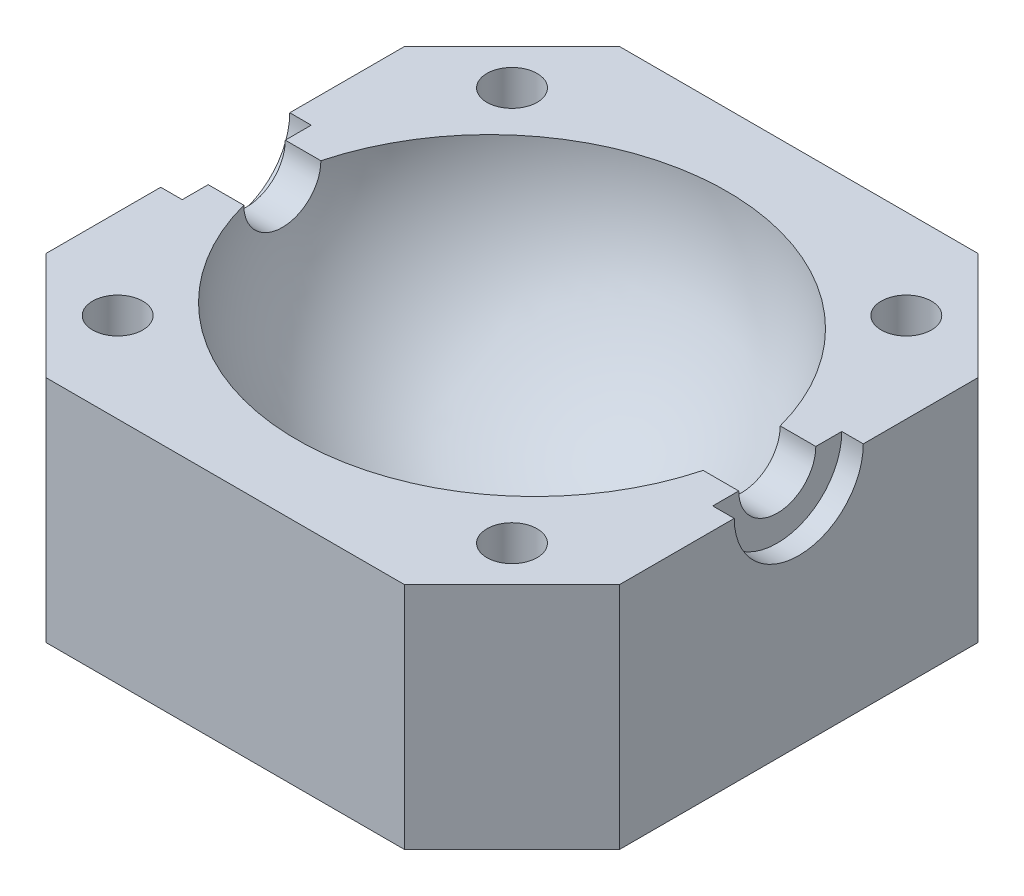
ISO-10303-21;
HEADER;
FILE_DESCRIPTION(('STEP AP214'),'2;1');
FILE_NAME('part.step','',(''),(''),'','','');
FILE_SCHEMA(('AUTOMOTIVE_DESIGN { 1 0 10303 214 1 1 1 1 }'));
ENDSEC;
DATA;
#1=APPLICATION_CONTEXT('core data for automotive mechanical design processes');
#2=APPLICATION_PROTOCOL_DEFINITION('international standard','automotive_design',2000,#1);
#3=PRODUCT_CONTEXT('',#1,'mechanical');
#4=PRODUCT('Part','Part','',(#3));
#5=PRODUCT_RELATED_PRODUCT_CATEGORY('part','',(#4));
#6=PRODUCT_DEFINITION_FORMATION('','',#4);
#7=PRODUCT_DEFINITION_CONTEXT('part definition',#1,'design');
#8=PRODUCT_DEFINITION('design','',#6,#7);
#9=PRODUCT_DEFINITION_SHAPE('','',#8);
#10=(LENGTH_UNIT() NAMED_UNIT(*) SI_UNIT(.MILLI.,.METRE.));
#11=(NAMED_UNIT(*) PLANE_ANGLE_UNIT() SI_UNIT($,.RADIAN.));
#12=(NAMED_UNIT(*) SI_UNIT($,.STERADIAN.) SOLID_ANGLE_UNIT());
#13=UNCERTAINTY_MEASURE_WITH_UNIT(LENGTH_MEASURE(1.E-05),#10,'distance_accuracy_value','');
#14=(GEOMETRIC_REPRESENTATION_CONTEXT(3) GLOBAL_UNCERTAINTY_ASSIGNED_CONTEXT((#13)) GLOBAL_UNIT_ASSIGNED_CONTEXT((#10,
#11,#12)) REPRESENTATION_CONTEXT('',''));
#15=CARTESIAN_POINT('',(0.,0.,0.));
#16=DIRECTION('',(0.,0.,1.));
#17=DIRECTION('',(1.,0.,0.));
#18=AXIS2_PLACEMENT_3D('',#15,#16,#17);
#19=CARTESIAN_POINT('',(40.,32.,0.));
#20=DIRECTION('',(-1.,0.,0.));
#21=DIRECTION('',(0.,0.,1.));
#22=AXIS2_PLACEMENT_3D('',#19,#20,#21);
#23=CYLINDRICAL_SURFACE('',#22,5.375);
#24=CARTESIAN_POINT('',(37.,32.,0.));
#25=DIRECTION('',(1.,0.,0.));
#26=DIRECTION('',(0.,0.,-1.));
#27=AXIS2_PLACEMENT_3D('',#24,#25,#26);
#28=CIRCLE('',#27,5.375);
#29=CARTESIAN_POINT('',(37.,32.,-5.37500000000001));
#30=VERTEX_POINT('',#29);
#31=CARTESIAN_POINT('',(37.,32.,5.37499999999999));
#32=VERTEX_POINT('',#31);
#33=EDGE_CURVE('E11',#30,#32,#28,.F.);
#34=ORIENTED_EDGE('',*,*,#33,.F.);
#35=DIRECTION('',(-1.,0.,0.));
#36=VECTOR('',#35,1.);
#37=CARTESIAN_POINT('',(40.,32.,-5.37500000000001));
#38=LINE('',#37,#36);
#39=CARTESIAN_POINT('',(32.0350881846765,32.,-5.375));
#40=VERTEX_POINT('',#39);
#41=EDGE_CURVE('E211',#30,#40,#38,.T.);
#42=ORIENTED_EDGE('',*,*,#41,.T.);
#43=CARTESIAN_POINT('',(32.0350881846765,32.,0.));
#44=DIRECTION('',(-1.,0.,0.));
#45=DIRECTION('',(0.,0.,1.));
#46=AXIS2_PLACEMENT_3D('',#43,#44,#45);
#47=CIRCLE('',#46,5.375);
#48=CARTESIAN_POINT('',(32.0350881846765,32.,5.375));
#49=VERTEX_POINT('',#48);
#50=EDGE_CURVE('E245',#49,#40,#47,.F.);
#51=ORIENTED_EDGE('',*,*,#50,.F.);
#52=DIRECTION('',(-1.,0.,0.));
#53=VECTOR('',#52,1.);
#54=CARTESIAN_POINT('',(40.,32.,5.37499999999999));
#55=LINE('',#54,#53);
#56=EDGE_CURVE('E207',#49,#32,#55,.F.);
#57=ORIENTED_EDGE('',*,*,#56,.T.);
#58=EDGE_LOOP('',(#34,#42,#51,#57));
#59=FACE_BOUND('',#58,.T.);
#60=ADVANCED_FACE('F35',(#59),#23,.F.);
#61=CARTESIAN_POINT('',(0.,32.,0.));
#62=DIRECTION('',(0.,1.,0.));
#63=DIRECTION('',(0.,0.,1.));
#64=AXIS2_PLACEMENT_3D('',#61,#62,#63);
#65=PLANE('',#64);
#66=DIRECTION('',(-1.,0.,0.));
#67=VECTOR('',#66,1.);
#68=CARTESIAN_POINT('',(40.,32.,-9.));
#69=LINE('',#68,#67);
#70=CARTESIAN_POINT('',(40.,32.,-9.));
#71=VERTEX_POINT('',#70);
#72=CARTESIAN_POINT('',(37.,32.,-9.));
#73=VERTEX_POINT('',#72);
#74=EDGE_CURVE('E163',#71,#73,#69,.T.);
#75=ORIENTED_EDGE('',*,*,#74,.F.);
#76=DIRECTION('',(0.,0.,-1.));
#77=VECTOR('',#76,1.);
#78=CARTESIAN_POINT('',(40.,32.,-40.));
#79=LINE('',#78,#77);
#80=CARTESIAN_POINT('',(40.,32.,-24.9999999999999));
#81=VERTEX_POINT('',#80);
#82=EDGE_CURVE('E217',#71,#81,#79,.T.);
#83=ORIENTED_EDGE('',*,*,#82,.T.);
#84=DIRECTION('',(0.707106781186546,0.,0.707106781186549));
#85=VECTOR('',#84,1.);
#86=CARTESIAN_POINT('',(32.5,32.,-32.4999999999999));
#87=LINE('',#86,#85);
#88=CARTESIAN_POINT('',(25.,32.,-40.));
#89=VERTEX_POINT('',#88);
#90=EDGE_CURVE('E272',#81,#89,#87,.F.);
#91=ORIENTED_EDGE('',*,*,#90,.T.);
#92=DIRECTION('',(-1.,0.,0.));
#93=VECTOR('',#92,1.);
#94=CARTESIAN_POINT('',(-40.,32.,-40.));
#95=LINE('',#94,#93);
#96=CARTESIAN_POINT('',(-24.9999999999999,32.,-40.));
#97=VERTEX_POINT('',#96);
#98=EDGE_CURVE('E216',#89,#97,#95,.T.);
#99=ORIENTED_EDGE('',*,*,#98,.T.);
#100=DIRECTION('',(0.707106781186549,0.,-0.707106781186546));
#101=VECTOR('',#100,1.);
#102=CARTESIAN_POINT('',(-32.4999999999999,32.,-32.5000000000001));
#103=LINE('',#102,#101);
#104=CARTESIAN_POINT('',(-40.,32.,-25.));
#105=VERTEX_POINT('',#104);
#106=EDGE_CURVE('E270',#97,#105,#103,.F.);
#107=ORIENTED_EDGE('',*,*,#106,.T.);
#108=DIRECTION('',(0.,0.,1.));
#109=VECTOR('',#108,1.);
#110=CARTESIAN_POINT('',(-40.,32.,-40.));
#111=LINE('',#110,#109);
#112=CARTESIAN_POINT('',(-40.,32.,-9.));
#113=VERTEX_POINT('',#112);
#114=EDGE_CURVE('E221',#105,#113,#111,.T.);
#115=ORIENTED_EDGE('',*,*,#114,.T.);
#116=DIRECTION('',(1.,0.,0.));
#117=VECTOR('',#116,1.);
#118=CARTESIAN_POINT('',(-40.,32.,-9.));
#119=LINE('',#118,#117);
#120=CARTESIAN_POINT('',(-37.,32.,-9.));
#121=VERTEX_POINT('',#120);
#122=EDGE_CURVE('E182',#113,#121,#119,.T.);
#123=ORIENTED_EDGE('',*,*,#122,.T.);
#124=DIRECTION('',(0.,0.,1.));
#125=VECTOR('',#124,1.);
#126=CARTESIAN_POINT('',(-37.,32.,0.));
#127=LINE('',#126,#125);
#128=CARTESIAN_POINT('',(-37.,32.,-5.37499999999999));
#129=VERTEX_POINT('',#128);
#130=EDGE_CURVE('E179',#121,#129,#127,.T.);
#131=ORIENTED_EDGE('',*,*,#130,.T.);
#132=CARTESIAN_POINT('',(-32.0350881846765,32.,-5.37499999999999));
#133=VERTEX_POINT('',#132);
#134=EDGE_CURVE('E214',#133,#129,#38,.T.);
#135=ORIENTED_EDGE('',*,*,#134,.F.);
#136=CARTESIAN_POINT('',(0.,32.,3.15000000000001));
#137=DIRECTION('',(0.,1.,0.));
#138=DIRECTION('',(0.,0.,1.));
#139=AXIS2_PLACEMENT_3D('',#136,#137,#138);
#140=CIRCLE('',#139,33.15);
#141=EDGE_CURVE('E242',#40,#133,#140,.T.);
#142=ORIENTED_EDGE('',*,*,#141,.F.);
#143=ORIENTED_EDGE('',*,*,#41,.F.);
#144=DIRECTION('',(0.,0.,-1.));
#145=VECTOR('',#144,1.);
#146=CARTESIAN_POINT('',(37.,32.,0.));
#147=LINE('',#146,#145);
#148=EDGE_CURVE('E50',#30,#73,#147,.T.);
#149=ORIENTED_EDGE('',*,*,#148,.T.);
#150=EDGE_LOOP('',(#75,#83,#91,#99,#107,#115,#123,#131,#135,#142,#143,#149));
#151=FACE_BOUND('',#150,.T.);
#152=CARTESIAN_POINT('',(27.5,32.,-27.5));
#153=DIRECTION('',(0.,1.,0.));
#154=DIRECTION('',(0.,0.,1.));
#155=AXIS2_PLACEMENT_3D('',#152,#153,#154);
#156=CIRCLE('',#155,3.5);
#157=CARTESIAN_POINT('',(27.5,32.,-24.));
#158=VERTEX_POINT('',#157);
#159=EDGE_CURVE('E190',#158,#158,#156,.T.);
#160=ORIENTED_EDGE('',*,*,#159,.F.);
#161=EDGE_LOOP('',(#160));
#162=FACE_BOUND('',#161,.T.);
#163=CARTESIAN_POINT('',(-27.5,32.,-27.5));
#164=DIRECTION('',(0.,1.,0.));
#165=DIRECTION('',(0.,0.,1.));
#166=AXIS2_PLACEMENT_3D('',#163,#164,#165);
#167=CIRCLE('',#166,3.5);
#168=CARTESIAN_POINT('',(-27.5,32.,-24.));
#169=VERTEX_POINT('',#168);
#170=EDGE_CURVE('E189',#169,#169,#167,.T.);
#171=ORIENTED_EDGE('',*,*,#170,.F.);
#172=EDGE_LOOP('',(#171));
#173=FACE_BOUND('',#172,.T.);
#174=ADVANCED_FACE('F319',(#151,#162,#173),#65,.T.);
#175=DIRECTION('',(-1.,0.,0.));
#176=VECTOR('',#175,1.);
#177=CARTESIAN_POINT('',(40.,32.,9.));
#178=LINE('',#177,#176);
#179=CARTESIAN_POINT('',(37.,32.,9.));
#180=VERTEX_POINT('',#179);
#181=CARTESIAN_POINT('',(40.,32.,9.));
#182=VERTEX_POINT('',#181);
#183=EDGE_CURVE('E160',#180,#182,#178,.F.);
#184=ORIENTED_EDGE('',*,*,#183,.F.);
#185=DIRECTION('',(0.,0.,-1.));
#186=VECTOR('',#185,1.);
#187=CARTESIAN_POINT('',(37.,32.,0.));
#188=LINE('',#187,#186);
#189=EDGE_CURVE('E148',#180,#32,#188,.T.);
#190=ORIENTED_EDGE('',*,*,#189,.T.);
#191=ORIENTED_EDGE('',*,*,#56,.F.);
#192=CARTESIAN_POINT('',(0.,32.,-3.15));
#193=DIRECTION('',(0.,1.,0.));
#194=DIRECTION('',(0.,0.,1.));
#195=AXIS2_PLACEMENT_3D('',#192,#193,#194);
#196=CIRCLE('',#195,33.15);
#197=CARTESIAN_POINT('',(-32.0350881846765,32.,5.37500000000001));
#198=VERTEX_POINT('',#197);
#199=EDGE_CURVE('E227',#198,#49,#196,.T.);
#200=ORIENTED_EDGE('',*,*,#199,.F.);
#201=CARTESIAN_POINT('',(-37.,32.,5.375));
#202=VERTEX_POINT('',#201);
#203=EDGE_CURVE('E212',#202,#198,#55,.F.);
#204=ORIENTED_EDGE('',*,*,#203,.F.);
#205=DIRECTION('',(0.,0.,1.));
#206=VECTOR('',#205,1.);
#207=CARTESIAN_POINT('',(-37.,32.,0.));
#208=LINE('',#207,#206);
#209=CARTESIAN_POINT('',(-37.,32.,9.));
#210=VERTEX_POINT('',#209);
#211=EDGE_CURVE('E58',#202,#210,#208,.T.);
#212=ORIENTED_EDGE('',*,*,#211,.T.);
#213=DIRECTION('',(1.,0.,0.));
#214=VECTOR('',#213,1.);
#215=CARTESIAN_POINT('',(-40.,32.,9.));
#216=LINE('',#215,#214);
#217=CARTESIAN_POINT('',(-40.,32.,9.));
#218=VERTEX_POINT('',#217);
#219=EDGE_CURVE('E44',#210,#218,#216,.F.);
#220=ORIENTED_EDGE('',*,*,#219,.T.);
#221=CARTESIAN_POINT('',(-40.,32.,24.9999999999999));
#222=VERTEX_POINT('',#221);
#223=EDGE_CURVE('E220',#218,#222,#111,.T.);
#224=ORIENTED_EDGE('',*,*,#223,.T.);
#225=DIRECTION('',(-0.707106781186546,0.,-0.707106781186549));
#226=VECTOR('',#225,1.);
#227=CARTESIAN_POINT('',(-32.5,32.,32.4999999999999));
#228=LINE('',#227,#226);
#229=CARTESIAN_POINT('',(-25.,32.,40.));
#230=VERTEX_POINT('',#229);
#231=EDGE_CURVE('E285',#222,#230,#228,.F.);
#232=ORIENTED_EDGE('',*,*,#231,.T.);
#233=DIRECTION('',(1.,0.,0.));
#234=VECTOR('',#233,1.);
#235=CARTESIAN_POINT('',(-40.,32.,40.));
#236=LINE('',#235,#234);
#237=CARTESIAN_POINT('',(24.9999999999999,32.,40.));
#238=VERTEX_POINT('',#237);
#239=EDGE_CURVE('E224',#230,#238,#236,.T.);
#240=ORIENTED_EDGE('',*,*,#239,.T.);
#241=DIRECTION('',(-0.70710678118655,0.,0.707106781186546));
#242=VECTOR('',#241,1.);
#243=CARTESIAN_POINT('',(32.4999999999999,32.,32.5000000000001));
#244=LINE('',#243,#242);
#245=CARTESIAN_POINT('',(40.,32.,25.));
#246=VERTEX_POINT('',#245);
#247=EDGE_CURVE('E287',#238,#246,#244,.F.);
#248=ORIENTED_EDGE('',*,*,#247,.T.);
#249=EDGE_CURVE('E169',#246,#182,#79,.T.);
#250=ORIENTED_EDGE('',*,*,#249,.T.);
#251=EDGE_LOOP('',(#184,#190,#191,#200,#204,#212,#220,#224,#232,#240,#248,#250));
#252=FACE_BOUND('',#251,.T.);
#253=CARTESIAN_POINT('',(-27.5,32.,27.5));
#254=DIRECTION('',(0.,1.,0.));
#255=DIRECTION('',(0.,0.,1.));
#256=AXIS2_PLACEMENT_3D('',#253,#254,#255);
#257=CIRCLE('',#256,3.5);
#258=CARTESIAN_POINT('',(-27.5,32.,31.));
#259=VERTEX_POINT('',#258);
#260=EDGE_CURVE('E185',#259,#259,#257,.T.);
#261=ORIENTED_EDGE('',*,*,#260,.F.);
#262=EDGE_LOOP('',(#261));
#263=FACE_BOUND('',#262,.T.);
#264=CARTESIAN_POINT('',(27.5,32.,27.5));
#265=DIRECTION('',(0.,1.,0.));
#266=DIRECTION('',(0.,0.,1.));
#267=AXIS2_PLACEMENT_3D('',#264,#265,#266);
#268=CIRCLE('',#267,3.5);
#269=CARTESIAN_POINT('',(27.5,32.,31.));
#270=VERTEX_POINT('',#269);
#271=EDGE_CURVE('E196',#270,#270,#268,.T.);
#272=ORIENTED_EDGE('',*,*,#271,.F.);
#273=EDGE_LOOP('',(#272));
#274=FACE_BOUND('',#273,.T.);
#275=ADVANCED_FACE('F166',(#252,#263,#274),#65,.T.);
#276=CARTESIAN_POINT('',(-37.,32.,0.));
#277=DIRECTION('',(-1.,0.,0.));
#278=DIRECTION('',(0.,0.,1.));
#279=AXIS2_PLACEMENT_3D('',#276,#277,#278);
#280=CIRCLE('',#279,5.375);
#281=EDGE_CURVE('E289',#202,#129,#280,.F.);
#282=ORIENTED_EDGE('',*,*,#281,.F.);
#283=ORIENTED_EDGE('',*,*,#203,.T.);
#284=CARTESIAN_POINT('',(-32.0350881846765,32.,0.));
#285=DIRECTION('',(1.,0.,0.));
#286=DIRECTION('',(0.,0.,-1.));
#287=AXIS2_PLACEMENT_3D('',#284,#285,#286);
#288=CIRCLE('',#287,5.375);
#289=EDGE_CURVE('E248',#133,#198,#288,.F.);
#290=ORIENTED_EDGE('',*,*,#289,.F.);
#291=ORIENTED_EDGE('',*,*,#134,.T.);
#292=EDGE_LOOP('',(#282,#283,#290,#291));
#293=FACE_BOUND('',#292,.T.);
#294=ADVANCED_FACE('F330',(#293),#23,.F.);
#295=CARTESIAN_POINT('',(40.,32.,-40.));
#296=DIRECTION('',(-1.,0.,0.));
#297=DIRECTION('',(0.,0.,1.));
#298=AXIS2_PLACEMENT_3D('',#295,#296,#297);
#299=PLANE('',#298);
#300=ORIENTED_EDGE('',*,*,#82,.F.);
#301=CARTESIAN_POINT('',(40.,32.,0.));
#302=DIRECTION('',(-1.,0.,0.));
#303=DIRECTION('',(0.,0.,1.));
#304=AXIS2_PLACEMENT_3D('',#301,#302,#303);
#305=CIRCLE('',#304,9.);
#306=EDGE_CURVE('E156',#71,#182,#305,.T.);
#307=ORIENTED_EDGE('',*,*,#306,.T.);
#308=ORIENTED_EDGE('',*,*,#249,.F.);
#309=DIRECTION('',(0.,-1.,0.));
#310=VECTOR('',#309,1.);
#311=CARTESIAN_POINT('',(40.,32.,25.));
#312=LINE('',#311,#310);
#313=CARTESIAN_POINT('',(40.,0.,25.));
#314=VERTEX_POINT('',#313);
#315=EDGE_CURVE('E264',#246,#314,#312,.T.);
#316=ORIENTED_EDGE('',*,*,#315,.T.);
#317=DIRECTION('',(0.,0.,-1.));
#318=VECTOR('',#317,1.);
#319=CARTESIAN_POINT('',(40.,0.,-40.));
#320=LINE('',#319,#318);
#321=CARTESIAN_POINT('',(40.,0.,-24.9999999999999));
#322=VERTEX_POINT('',#321);
#323=EDGE_CURVE('E228',#314,#322,#320,.T.);
#324=ORIENTED_EDGE('',*,*,#323,.T.);
#325=DIRECTION('',(0.,1.,0.));
#326=VECTOR('',#325,1.);
#327=CARTESIAN_POINT('',(40.,32.,-24.9999999999999));
#328=LINE('',#327,#326);
#329=EDGE_CURVE('E267',#322,#81,#328,.T.);
#330=ORIENTED_EDGE('',*,*,#329,.T.);
#331=EDGE_LOOP('',(#300,#307,#308,#316,#324,#330));
#332=FACE_BOUND('',#331,.T.);
#333=ADVANCED_FACE('F315',(#332),#299,.F.);
#334=CARTESIAN_POINT('',(-40.,32.,-40.));
#335=DIRECTION('',(0.,0.,1.));
#336=DIRECTION('',(1.,0.,0.));
#337=AXIS2_PLACEMENT_3D('',#334,#335,#336);
#338=PLANE('',#337);
#339=ORIENTED_EDGE('',*,*,#98,.F.);
#340=DIRECTION('',(0.,-1.,0.));
#341=VECTOR('',#340,1.);
#342=CARTESIAN_POINT('',(25.,32.,-40.));
#343=LINE('',#342,#341);
#344=CARTESIAN_POINT('',(25.,0.,-40.));
#345=VERTEX_POINT('',#344);
#346=EDGE_CURVE('E253',#89,#345,#343,.T.);
#347=ORIENTED_EDGE('',*,*,#346,.T.);
#348=DIRECTION('',(-1.,0.,0.));
#349=VECTOR('',#348,1.);
#350=CARTESIAN_POINT('',(-40.,0.,-40.));
#351=LINE('',#350,#349);
#352=CARTESIAN_POINT('',(-24.9999999999999,0.,-40.));
#353=VERTEX_POINT('',#352);
#354=EDGE_CURVE('E231',#345,#353,#351,.T.);
#355=ORIENTED_EDGE('',*,*,#354,.T.);
#356=DIRECTION('',(0.,1.,0.));
#357=VECTOR('',#356,1.);
#358=CARTESIAN_POINT('',(-24.9999999999999,32.,-40.));
#359=LINE('',#358,#357);
#360=EDGE_CURVE('E251',#353,#97,#359,.T.);
#361=ORIENTED_EDGE('',*,*,#360,.T.);
#362=EDGE_LOOP('',(#339,#347,#355,#361));
#363=FACE_BOUND('',#362,.T.);
#364=ADVANCED_FACE('F357',(#363),#338,.F.);
#365=CARTESIAN_POINT('',(-40.,32.,-40.));
#366=DIRECTION('',(1.,0.,0.));
#367=DIRECTION('',(0.,0.,-1.));
#368=AXIS2_PLACEMENT_3D('',#365,#366,#367);
#369=PLANE('',#368);
#370=CARTESIAN_POINT('',(-40.,32.,0.));
#371=DIRECTION('',(-1.,0.,0.));
#372=DIRECTION('',(0.,0.,1.));
#373=AXIS2_PLACEMENT_3D('',#370,#371,#372);
#374=CIRCLE('',#373,9.);
#375=EDGE_CURVE('E175',#113,#218,#374,.T.);
#376=ORIENTED_EDGE('',*,*,#375,.F.);
#377=ORIENTED_EDGE('',*,*,#114,.F.);
#378=DIRECTION('',(0.,-1.,0.));
#379=VECTOR('',#378,1.);
#380=CARTESIAN_POINT('',(-40.,32.,-25.));
#381=LINE('',#380,#379);
#382=CARTESIAN_POINT('',(-40.,0.,-25.));
#383=VERTEX_POINT('',#382);
#384=EDGE_CURVE('E277',#105,#383,#381,.T.);
#385=ORIENTED_EDGE('',*,*,#384,.T.);
#386=DIRECTION('',(0.,0.,1.));
#387=VECTOR('',#386,1.);
#388=CARTESIAN_POINT('',(-40.,0.,-40.));
#389=LINE('',#388,#387);
#390=CARTESIAN_POINT('',(-40.,0.,24.9999999999999));
#391=VERTEX_POINT('',#390);
#392=EDGE_CURVE('E234',#383,#391,#389,.T.);
#393=ORIENTED_EDGE('',*,*,#392,.T.);
#394=DIRECTION('',(0.,1.,0.));
#395=VECTOR('',#394,1.);
#396=CARTESIAN_POINT('',(-40.,32.,24.9999999999999));
#397=LINE('',#396,#395);
#398=EDGE_CURVE('E274',#391,#222,#397,.T.);
#399=ORIENTED_EDGE('',*,*,#398,.T.);
#400=ORIENTED_EDGE('',*,*,#223,.F.);
#401=EDGE_LOOP('',(#376,#377,#385,#393,#399,#400));
#402=FACE_BOUND('',#401,.T.);
#403=ADVANCED_FACE('F297',(#402),#369,.F.);
#404=CARTESIAN_POINT('',(-40.,32.,40.));
#405=DIRECTION('',(0.,0.,-1.));
#406=DIRECTION('',(-1.,0.,0.));
#407=AXIS2_PLACEMENT_3D('',#404,#405,#406);
#408=PLANE('',#407);
#409=DIRECTION('',(1.,0.,0.));
#410=VECTOR('',#409,1.);
#411=CARTESIAN_POINT('',(-40.,0.,40.));
#412=LINE('',#411,#410);
#413=CARTESIAN_POINT('',(-25.,0.,40.));
#414=VERTEX_POINT('',#413);
#415=CARTESIAN_POINT('',(24.9999999999999,0.,40.));
#416=VERTEX_POINT('',#415);
#417=EDGE_CURVE('E237',#414,#416,#412,.T.);
#418=ORIENTED_EDGE('',*,*,#417,.T.);
#419=DIRECTION('',(0.,1.,0.));
#420=VECTOR('',#419,1.);
#421=CARTESIAN_POINT('',(24.9999999999999,32.,40.));
#422=LINE('',#421,#420);
#423=EDGE_CURVE('E283',#416,#238,#422,.T.);
#424=ORIENTED_EDGE('',*,*,#423,.T.);
#425=ORIENTED_EDGE('',*,*,#239,.F.);
#426=DIRECTION('',(0.,-1.,0.));
#427=VECTOR('',#426,1.);
#428=CARTESIAN_POINT('',(-25.,32.,40.));
#429=LINE('',#428,#427);
#430=EDGE_CURVE('E280',#230,#414,#429,.T.);
#431=ORIENTED_EDGE('',*,*,#430,.T.);
#432=EDGE_LOOP('',(#418,#424,#425,#431));
#433=FACE_BOUND('',#432,.T.);
#434=ADVANCED_FACE('F307',(#433),#408,.F.);
#435=CARTESIAN_POINT('',(0.,0.,0.));
#436=DIRECTION('',(0.,1.,0.));
#437=DIRECTION('',(0.,0.,1.));
#438=AXIS2_PLACEMENT_3D('',#435,#436,#437);
#439=PLANE('',#438);
#440=ORIENTED_EDGE('',*,*,#354,.F.);
#441=DIRECTION('',(-0.707106781186546,0.,-0.707106781186549));
#442=VECTOR('',#441,1.);
#443=CARTESIAN_POINT('',(25.,0.,-40.));
#444=LINE('',#443,#442);
#445=EDGE_CURVE('E262',#345,#322,#444,.F.);
#446=ORIENTED_EDGE('',*,*,#445,.T.);
#447=ORIENTED_EDGE('',*,*,#323,.F.);
#448=DIRECTION('',(0.70710678118655,0.,-0.707106781186546));
#449=VECTOR('',#448,1.);
#450=CARTESIAN_POINT('',(40.,0.,25.));
#451=LINE('',#450,#449);
#452=EDGE_CURVE('E258',#314,#416,#451,.F.);
#453=ORIENTED_EDGE('',*,*,#452,.T.);
#454=ORIENTED_EDGE('',*,*,#417,.F.);
#455=DIRECTION('',(0.707106781186546,0.,0.707106781186549));
#456=VECTOR('',#455,1.);
#457=CARTESIAN_POINT('',(-25.,0.,40.));
#458=LINE('',#457,#456);
#459=EDGE_CURVE('E256',#414,#391,#458,.F.);
#460=ORIENTED_EDGE('',*,*,#459,.T.);
#461=ORIENTED_EDGE('',*,*,#392,.F.);
#462=DIRECTION('',(-0.707106781186549,0.,0.707106781186546));
#463=VECTOR('',#462,1.);
#464=CARTESIAN_POINT('',(-40.,0.,-25.));
#465=LINE('',#464,#463);
#466=EDGE_CURVE('E260',#383,#353,#465,.F.);
#467=ORIENTED_EDGE('',*,*,#466,.T.);
#468=EDGE_LOOP('',(#440,#446,#447,#453,#454,#460,#461,#467));
#469=FACE_BOUND('',#468,.T.);
#470=ADVANCED_FACE('F362',(#469),#439,.F.);
#471=CARTESIAN_POINT('',(0.,32.,0.));
#472=DIRECTION('',(-1.,0.,0.));
#473=DIRECTION('',(0.,0.,1.));
#474=AXIS2_PLACEMENT_3D('',#471,#472,#473);
#475=DEGENERATE_TOROIDAL_SURFACE('',#474,3.15,33.15,.F.);
#476=ORIENTED_EDGE('',*,*,#141,.T.);
#477=ORIENTED_EDGE('',*,*,#289,.T.);
#478=ORIENTED_EDGE('',*,*,#199,.T.);
#479=ORIENTED_EDGE('',*,*,#50,.T.);
#480=EDGE_LOOP('',(#476,#477,#478,#479));
#481=FACE_BOUND('',#480,.T.);
#482=ADVANCED_FACE('F326',(#481),#475,.T.);
#483=CARTESIAN_POINT('',(25.,32.,-40.));
#484=DIRECTION('',(-0.707106781186549,0.,0.707106781186546));
#485=DIRECTION('',(0.,-1.,0.));
#486=AXIS2_PLACEMENT_3D('',#483,#484,#485);
#487=PLANE('',#486);
#488=ORIENTED_EDGE('',*,*,#90,.F.);
#489=ORIENTED_EDGE('',*,*,#329,.F.);
#490=ORIENTED_EDGE('',*,*,#445,.F.);
#491=ORIENTED_EDGE('',*,*,#346,.F.);
#492=EDGE_LOOP('',(#488,#489,#490,#491));
#493=FACE_BOUND('',#492,.T.);
#494=ADVANCED_FACE('F374',(#493),#487,.F.);
#495=CARTESIAN_POINT('',(-40.,32.,-25.));
#496=DIRECTION('',(0.707106781186546,0.,0.707106781186549));
#497=DIRECTION('',(0.,-1.,0.));
#498=AXIS2_PLACEMENT_3D('',#495,#496,#497);
#499=PLANE('',#498);
#500=ORIENTED_EDGE('',*,*,#106,.F.);
#501=ORIENTED_EDGE('',*,*,#360,.F.);
#502=ORIENTED_EDGE('',*,*,#466,.F.);
#503=ORIENTED_EDGE('',*,*,#384,.F.);
#504=EDGE_LOOP('',(#500,#501,#502,#503));
#505=FACE_BOUND('',#504,.T.);
#506=ADVANCED_FACE('F380',(#505),#499,.F.);
#507=CARTESIAN_POINT('',(40.,32.,25.));
#508=DIRECTION('',(-0.707106781186545,0.,-0.707106781186549));
#509=DIRECTION('',(0.,-1.,0.));
#510=AXIS2_PLACEMENT_3D('',#507,#508,#509);
#511=PLANE('',#510);
#512=ORIENTED_EDGE('',*,*,#247,.F.);
#513=ORIENTED_EDGE('',*,*,#423,.F.);
#514=ORIENTED_EDGE('',*,*,#452,.F.);
#515=ORIENTED_EDGE('',*,*,#315,.F.);
#516=EDGE_LOOP('',(#512,#513,#514,#515));
#517=FACE_BOUND('',#516,.T.);
#518=ADVANCED_FACE('F311',(#517),#511,.F.);
#519=CARTESIAN_POINT('',(-25.,32.,40.));
#520=DIRECTION('',(0.707106781186549,0.,-0.707106781186546));
#521=DIRECTION('',(0.,-1.,0.));
#522=AXIS2_PLACEMENT_3D('',#519,#520,#521);
#523=PLANE('',#522);
#524=ORIENTED_EDGE('',*,*,#231,.F.);
#525=ORIENTED_EDGE('',*,*,#398,.F.);
#526=ORIENTED_EDGE('',*,*,#459,.F.);
#527=ORIENTED_EDGE('',*,*,#430,.F.);
#528=EDGE_LOOP('',(#524,#525,#526,#527));
#529=FACE_BOUND('',#528,.T.);
#530=ADVANCED_FACE('F38',(#529),#523,.F.);
#531=CARTESIAN_POINT('',(27.5,24.5,27.5));
#532=DIRECTION('',(0.,1.,0.));
#533=DIRECTION('',(0.,0.,1.));
#534=AXIS2_PLACEMENT_3D('',#531,#532,#533);
#535=CYLINDRICAL_SURFACE('',#534,3.5);
#536=CARTESIAN_POINT('',(27.5,24.5,27.5));
#537=DIRECTION('',(0.,1.,0.));
#538=DIRECTION('',(0.,0.,1.));
#539=AXIS2_PLACEMENT_3D('',#536,#537,#538);
#540=CIRCLE('',#539,3.5);
#541=CARTESIAN_POINT('',(27.5,24.5,31.));
#542=VERTEX_POINT('',#541);
#543=EDGE_CURVE('E193',#542,#542,#540,.T.);
#544=ORIENTED_EDGE('',*,*,#543,.F.);
#545=EDGE_LOOP('',(#544));
#546=FACE_BOUND('',#545,.T.);
#547=ORIENTED_EDGE('',*,*,#271,.T.);
#548=EDGE_LOOP('',(#547));
#549=FACE_BOUND('',#548,.T.);
#550=ADVANCED_FACE('F393',(#546,#549),#535,.F.);
#551=CARTESIAN_POINT('',(27.5,24.5,27.5));
#552=DIRECTION('',(0.,1.,0.));
#553=DIRECTION('',(0.,0.,1.));
#554=AXIS2_PLACEMENT_3D('',#551,#552,#553);
#555=PLANE('',#554);
#556=ORIENTED_EDGE('',*,*,#543,.T.);
#557=EDGE_LOOP('',(#556));
#558=FACE_BOUND('',#557,.T.);
#559=ADVANCED_FACE('F397',(#558),#555,.T.);
#560=CARTESIAN_POINT('',(-27.5,24.5,27.5));
#561=DIRECTION('',(0.,1.,0.));
#562=DIRECTION('',(0.,0.,1.));
#563=AXIS2_PLACEMENT_3D('',#560,#561,#562);
#564=CYLINDRICAL_SURFACE('',#563,3.5);
#565=CARTESIAN_POINT('',(-27.5,24.5,27.5));
#566=DIRECTION('',(0.,1.,0.));
#567=DIRECTION('',(0.,0.,1.));
#568=AXIS2_PLACEMENT_3D('',#565,#566,#567);
#569=CIRCLE('',#568,3.5);
#570=CARTESIAN_POINT('',(-27.5,24.5,31.));
#571=VERTEX_POINT('',#570);
#572=EDGE_CURVE('E199',#571,#571,#569,.T.);
#573=ORIENTED_EDGE('',*,*,#572,.F.);
#574=EDGE_LOOP('',(#573));
#575=FACE_BOUND('',#574,.T.);
#576=ORIENTED_EDGE('',*,*,#260,.T.);
#577=EDGE_LOOP('',(#576));
#578=FACE_BOUND('',#577,.T.);
#579=ADVANCED_FACE('F403',(#575,#578),#564,.F.);
#580=CARTESIAN_POINT('',(-27.5,24.5,27.5));
#581=DIRECTION('',(0.,1.,0.));
#582=DIRECTION('',(0.,0.,1.));
#583=AXIS2_PLACEMENT_3D('',#580,#581,#582);
#584=PLANE('',#583);
#585=ORIENTED_EDGE('',*,*,#572,.T.);
#586=EDGE_LOOP('',(#585));
#587=FACE_BOUND('',#586,.T.);
#588=ADVANCED_FACE('F410',(#587),#584,.T.);
#589=CARTESIAN_POINT('',(-27.5,24.5,-27.5));
#590=DIRECTION('',(0.,1.,0.));
#591=DIRECTION('',(0.,0.,1.));
#592=AXIS2_PLACEMENT_3D('',#589,#590,#591);
#593=CYLINDRICAL_SURFACE('',#592,3.5);
#594=CARTESIAN_POINT('',(-27.5,24.5,-27.5));
#595=DIRECTION('',(0.,1.,0.));
#596=DIRECTION('',(0.,0.,1.));
#597=AXIS2_PLACEMENT_3D('',#594,#595,#596);
#598=CIRCLE('',#597,3.5);
#599=CARTESIAN_POINT('',(-27.5,24.5,-24.));
#600=VERTEX_POINT('',#599);
#601=EDGE_CURVE('E204',#600,#600,#598,.T.);
#602=ORIENTED_EDGE('',*,*,#601,.F.);
#603=EDGE_LOOP('',(#602));
#604=FACE_BOUND('',#603,.T.);
#605=ORIENTED_EDGE('',*,*,#170,.T.);
#606=EDGE_LOOP('',(#605));
#607=FACE_BOUND('',#606,.T.);
#608=ADVANCED_FACE('F413',(#604,#607),#593,.F.);
#609=CARTESIAN_POINT('',(-27.5,24.5,-27.5));
#610=DIRECTION('',(0.,1.,0.));
#611=DIRECTION('',(0.,0.,1.));
#612=AXIS2_PLACEMENT_3D('',#609,#610,#611);
#613=PLANE('',#612);
#614=ORIENTED_EDGE('',*,*,#601,.T.);
#615=EDGE_LOOP('',(#614));
#616=FACE_BOUND('',#615,.T.);
#617=ADVANCED_FACE('F418',(#616),#613,.T.);
#618=CARTESIAN_POINT('',(27.5,24.5,-27.5));
#619=DIRECTION('',(0.,1.,0.));
#620=DIRECTION('',(0.,0.,1.));
#621=AXIS2_PLACEMENT_3D('',#618,#619,#620);
#622=CYLINDRICAL_SURFACE('',#621,3.5);
#623=CARTESIAN_POINT('',(27.5,24.5,-27.5));
#624=DIRECTION('',(0.,1.,0.));
#625=DIRECTION('',(0.,0.,1.));
#626=AXIS2_PLACEMENT_3D('',#623,#624,#625);
#627=CIRCLE('',#626,3.5);
#628=CARTESIAN_POINT('',(27.5,24.5,-24.));
#629=VERTEX_POINT('',#628);
#630=EDGE_CURVE('E186',#629,#629,#627,.T.);
#631=ORIENTED_EDGE('',*,*,#630,.F.);
#632=EDGE_LOOP('',(#631));
#633=FACE_BOUND('',#632,.T.);
#634=ORIENTED_EDGE('',*,*,#159,.T.);
#635=EDGE_LOOP('',(#634));
#636=FACE_BOUND('',#635,.T.);
#637=ADVANCED_FACE('F341',(#633,#636),#622,.F.);
#638=CARTESIAN_POINT('',(27.5,24.5,-27.5));
#639=DIRECTION('',(0.,1.,0.));
#640=DIRECTION('',(0.,0.,1.));
#641=AXIS2_PLACEMENT_3D('',#638,#639,#640);
#642=PLANE('',#641);
#643=ORIENTED_EDGE('',*,*,#630,.T.);
#644=EDGE_LOOP('',(#643));
#645=FACE_BOUND('',#644,.T.);
#646=ADVANCED_FACE('F334',(#645),#642,.T.);
#647=CARTESIAN_POINT('',(-40.,32.,0.));
#648=DIRECTION('',(1.,0.,0.));
#649=DIRECTION('',(0.,0.,-1.));
#650=AXIS2_PLACEMENT_3D('',#647,#648,#649);
#651=CYLINDRICAL_SURFACE('',#650,9.);
#652=ORIENTED_EDGE('',*,*,#375,.T.);
#653=ORIENTED_EDGE('',*,*,#219,.F.);
#654=CARTESIAN_POINT('',(-37.,32.,0.));
#655=DIRECTION('',(-1.,0.,0.));
#656=DIRECTION('',(0.,0.,1.));
#657=AXIS2_PLACEMENT_3D('',#654,#655,#656);
#658=CIRCLE('',#657,9.);
#659=EDGE_CURVE('E171',#121,#210,#658,.T.);
#660=ORIENTED_EDGE('',*,*,#659,.F.);
#661=ORIENTED_EDGE('',*,*,#122,.F.);
#662=EDGE_LOOP('',(#652,#653,#660,#661));
#663=FACE_BOUND('',#662,.T.);
#664=ADVANCED_FACE('F332',(#663),#651,.F.);
#665=CARTESIAN_POINT('',(-37.,32.,0.));
#666=DIRECTION('',(-1.,0.,0.));
#667=DIRECTION('',(0.,0.,1.));
#668=AXIS2_PLACEMENT_3D('',#665,#666,#667);
#669=PLANE('',#668);
#670=ORIENTED_EDGE('',*,*,#659,.T.);
#671=ORIENTED_EDGE('',*,*,#211,.F.);
#672=ORIENTED_EDGE('',*,*,#281,.T.);
#673=ORIENTED_EDGE('',*,*,#130,.F.);
#674=EDGE_LOOP('',(#670,#671,#672,#673));
#675=FACE_BOUND('',#674,.T.);
#676=ADVANCED_FACE('F331',(#675),#669,.T.);
#677=CARTESIAN_POINT('',(40.,32.,0.));
#678=DIRECTION('',(-1.,0.,0.));
#679=DIRECTION('',(0.,0.,1.));
#680=AXIS2_PLACEMENT_3D('',#677,#678,#679);
#681=CYLINDRICAL_SURFACE('',#680,9.);
#682=ORIENTED_EDGE('',*,*,#74,.T.);
#683=CARTESIAN_POINT('',(37.,32.,0.));
#684=DIRECTION('',(-1.,0.,0.));
#685=DIRECTION('',(0.,0.,1.));
#686=AXIS2_PLACEMENT_3D('',#683,#684,#685);
#687=CIRCLE('',#686,9.);
#688=EDGE_CURVE('E151',#73,#180,#687,.T.);
#689=ORIENTED_EDGE('',*,*,#688,.T.);
#690=ORIENTED_EDGE('',*,*,#183,.T.);
#691=ORIENTED_EDGE('',*,*,#306,.F.);
#692=EDGE_LOOP('',(#682,#689,#690,#691));
#693=FACE_BOUND('',#692,.T.);
#694=ADVANCED_FACE('F159',(#693),#681,.F.);
#695=CARTESIAN_POINT('',(37.,32.,0.));
#696=DIRECTION('',(1.,0.,0.));
#697=DIRECTION('',(0.,0.,1.));
#698=AXIS2_PLACEMENT_3D('',#695,#696,#697);
#699=PLANE('',#698);
#700=ORIENTED_EDGE('',*,*,#33,.T.);
#701=ORIENTED_EDGE('',*,*,#189,.F.);
#702=ORIENTED_EDGE('',*,*,#688,.F.);
#703=ORIENTED_EDGE('',*,*,#148,.F.);
#704=EDGE_LOOP('',(#700,#701,#702,#703));
#705=FACE_BOUND('',#704,.T.);
#706=ADVANCED_FACE('F150',(#705),#699,.T.);
#707=CLOSED_SHELL('',(#60,#174,#275,#294,#333,#364,#403,#434,#470,#482,#494,#506,#518,#530,#550,
#559,#579,#588,#608,#617,#637,#646,#664,#676,#694,#706));
#708=MANIFOLD_SOLID_BREP('B2',#707);
#709=ADVANCED_BREP_SHAPE_REPRESENTATION('',(#18,#708),#14);
#710=SHAPE_DEFINITION_REPRESENTATION(#9,#709);
ENDSEC;
END-ISO-10303-21;
